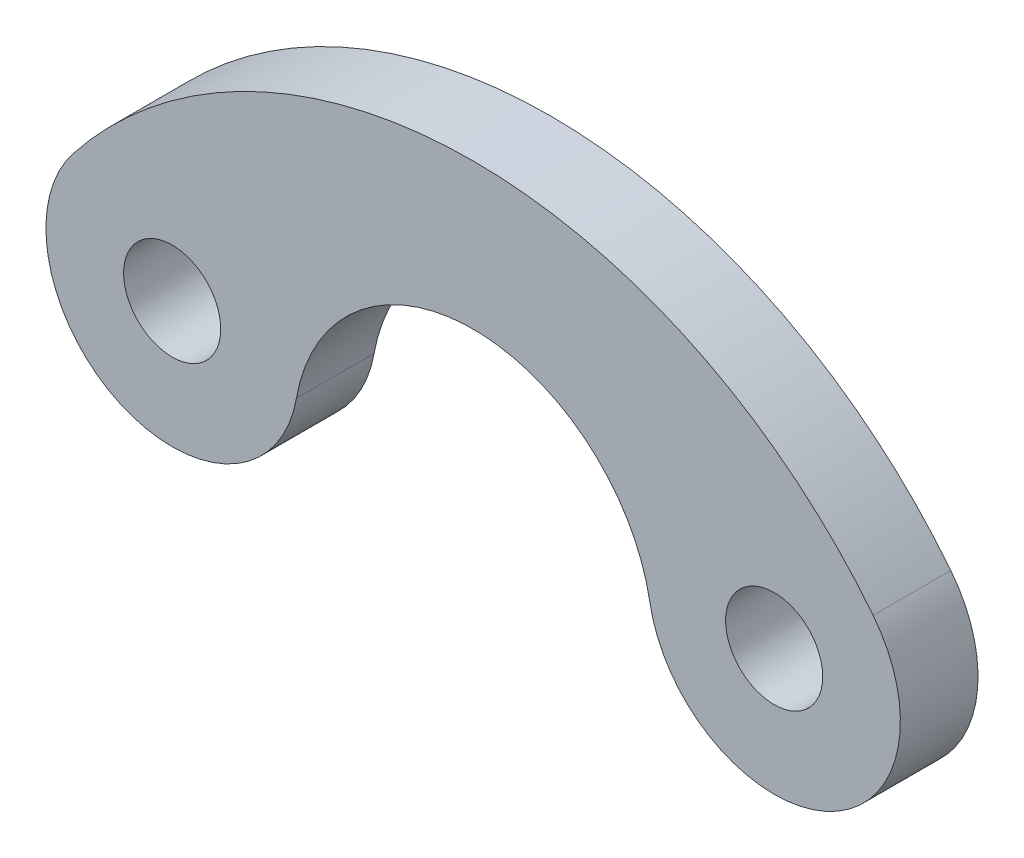
ISO-10303-21;
HEADER;
FILE_DESCRIPTION(('STEP AP214'),'2;1');
FILE_NAME('part.step','',(''),(''),'','','');
FILE_SCHEMA(('AUTOMOTIVE_DESIGN { 1 0 10303 214 1 1 1 1 }'));
ENDSEC;
DATA;
#1=APPLICATION_CONTEXT('core data for automotive mechanical design processes');
#2=APPLICATION_PROTOCOL_DEFINITION('international standard','automotive_design',2000,#1);
#3=PRODUCT_CONTEXT('',#1,'mechanical');
#4=PRODUCT('Part','Part','',(#3));
#5=PRODUCT_RELATED_PRODUCT_CATEGORY('part','',(#4));
#6=PRODUCT_DEFINITION_FORMATION('','',#4);
#7=PRODUCT_DEFINITION_CONTEXT('part definition',#1,'design');
#8=PRODUCT_DEFINITION('design','',#6,#7);
#9=PRODUCT_DEFINITION_SHAPE('','',#8);
#10=(LENGTH_UNIT() NAMED_UNIT(*) SI_UNIT(.MILLI.,.METRE.));
#11=(NAMED_UNIT(*) PLANE_ANGLE_UNIT() SI_UNIT($,.RADIAN.));
#12=(NAMED_UNIT(*) SI_UNIT($,.STERADIAN.) SOLID_ANGLE_UNIT());
#13=UNCERTAINTY_MEASURE_WITH_UNIT(LENGTH_MEASURE(1.E-05),#10,'distance_accuracy_value','');
#14=(GEOMETRIC_REPRESENTATION_CONTEXT(3) GLOBAL_UNCERTAINTY_ASSIGNED_CONTEXT((#13)) GLOBAL_UNIT_ASSIGNED_CONTEXT((#10,
#11,#12)) REPRESENTATION_CONTEXT('',''));
#15=CARTESIAN_POINT('',(0.,0.,0.));
#16=DIRECTION('',(0.,0.,1.));
#17=DIRECTION('',(1.,0.,0.));
#18=AXIS2_PLACEMENT_3D('',#15,#16,#17);
#19=CARTESIAN_POINT('',(-3.937,-0.696057692307692,2.032));
#20=DIRECTION('',(0.,0.,-1.));
#21=DIRECTION('',(-1.,0.,0.));
#22=AXIS2_PLACEMENT_3D('',#19,#20,#21);
#23=PLANE('',#22);
#24=CARTESIAN_POINT('',(0.,0.,2.032));
#25=DIRECTION('',(0.,0.,1.));
#26=DIRECTION('',(1.,0.,0.));
#27=AXIS2_PLACEMENT_3D('',#24,#25,#26);
#28=CIRCLE('',#27,1.27);
#29=CARTESIAN_POINT('',(1.27,0.,2.032));
#30=VERTEX_POINT('',#29);
#31=EDGE_CURVE('E115',#30,#30,#28,.T.);
#32=ORIENTED_EDGE('',*,*,#31,.F.);
#33=EDGE_LOOP('',(#32));
#34=FACE_BOUND('',#33,.T.);
#35=CARTESIAN_POINT('',(-7.874,-1.39211538461538,2.032));
#36=DIRECTION('',(0.,0.,-1.));
#37=DIRECTION('',(-1.,0.,0.));
#38=AXIS2_PLACEMENT_3D('',#35,#36,#37);
#39=CIRCLE('',#38,4.69411538461539);
#40=CARTESIAN_POINT('',(-12.4964276114844,-0.574874770922418,2.032));
#41=VERTEX_POINT('',#40);
#42=CARTESIAN_POINT('',(-3.25157238851557,-0.574874770922417,2.032));
#43=VERTEX_POINT('',#42);
#44=EDGE_CURVE('E95',#41,#43,#39,.T.);
#45=ORIENTED_EDGE('',*,*,#44,.T.);
#46=CARTESIAN_POINT('',(0.,0.,2.032));
#47=DIRECTION('',(0.,0.,1.));
#48=DIRECTION('',(1.,0.,0.));
#49=AXIS2_PLACEMENT_3D('',#46,#47,#48);
#50=CIRCLE('',#49,3.30199999999999);
#51=CARTESIAN_POINT('',(2.58925801011804,2.04913322091061,2.032));
#52=VERTEX_POINT('',#51);
#53=EDGE_CURVE('E90',#43,#52,#50,.T.);
#54=ORIENTED_EDGE('',*,*,#53,.T.);
#55=CARTESIAN_POINT('',(-7.874,-6.23146666666666,2.032));
#56=DIRECTION('',(0.,0.,1.));
#57=DIRECTION('',(-1.,0.,0.));
#58=AXIS2_PLACEMENT_3D('',#55,#56,#57);
#59=CIRCLE('',#58,13.3434666666666);
#60=CARTESIAN_POINT('',(-18.337258010118,2.04913322091062,2.032));
#61=VERTEX_POINT('',#60);
#62=EDGE_CURVE('E93',#52,#61,#59,.T.);
#63=ORIENTED_EDGE('',*,*,#62,.T.);
#64=CARTESIAN_POINT('',(-15.748,0.,2.032));
#65=DIRECTION('',(0.,0.,1.));
#66=DIRECTION('',(1.,0.,0.));
#67=AXIS2_PLACEMENT_3D('',#64,#65,#66);
#68=CIRCLE('',#67,3.30199999999999);
#69=EDGE_CURVE('E60',#61,#41,#68,.T.);
#70=ORIENTED_EDGE('',*,*,#69,.T.);
#71=EDGE_LOOP('',(#45,#54,#63,#70));
#72=FACE_BOUND('',#71,.T.);
#73=CARTESIAN_POINT('',(-15.748,0.,2.032));
#74=DIRECTION('',(0.,0.,1.));
#75=DIRECTION('',(1.,0.,0.));
#76=AXIS2_PLACEMENT_3D('',#73,#74,#75);
#77=CIRCLE('',#76,1.27);
#78=CARTESIAN_POINT('',(-14.478,0.,2.032));
#79=VERTEX_POINT('',#78);
#80=EDGE_CURVE('E132',#79,#79,#77,.T.);
#81=ORIENTED_EDGE('',*,*,#80,.F.);
#82=EDGE_LOOP('',(#81));
#83=FACE_BOUND('',#82,.T.);
#84=ADVANCED_FACE('F41',(#34,#72,#83),#23,.F.);
#85=CARTESIAN_POINT('',(-3.937,-0.696057692307692,0.));
#86=DIRECTION('',(0.,0.,-1.));
#87=DIRECTION('',(-1.,0.,0.));
#88=AXIS2_PLACEMENT_3D('',#85,#86,#87);
#89=PLANE('',#88);
#90=CARTESIAN_POINT('',(0.,0.,0.));
#91=DIRECTION('',(0.,0.,1.));
#92=DIRECTION('',(1.,0.,0.));
#93=AXIS2_PLACEMENT_3D('',#90,#91,#92);
#94=CIRCLE('',#93,1.27);
#95=CARTESIAN_POINT('',(1.27,0.,0.));
#96=VERTEX_POINT('',#95);
#97=EDGE_CURVE('E129',#96,#96,#94,.T.);
#98=ORIENTED_EDGE('',*,*,#97,.T.);
#99=EDGE_LOOP('',(#98));
#100=FACE_BOUND('',#99,.T.);
#101=CARTESIAN_POINT('',(-7.874,-1.39211538461538,0.));
#102=DIRECTION('',(0.,0.,-1.));
#103=DIRECTION('',(-1.,0.,0.));
#104=AXIS2_PLACEMENT_3D('',#101,#102,#103);
#105=CIRCLE('',#104,4.69411538461539);
#106=CARTESIAN_POINT('',(-12.4964276114844,-0.574874770922418,0.));
#107=VERTEX_POINT('',#106);
#108=CARTESIAN_POINT('',(-3.25157238851557,-0.574874770922417,0.));
#109=VERTEX_POINT('',#108);
#110=EDGE_CURVE('E111',#107,#109,#105,.T.);
#111=ORIENTED_EDGE('',*,*,#110,.F.);
#112=CARTESIAN_POINT('',(-15.748,0.,0.));
#113=DIRECTION('',(0.,0.,1.));
#114=DIRECTION('',(1.,0.,0.));
#115=AXIS2_PLACEMENT_3D('',#112,#113,#114);
#116=CIRCLE('',#115,3.30199999999999);
#117=CARTESIAN_POINT('',(-18.337258010118,2.04913322091062,0.));
#118=VERTEX_POINT('',#117);
#119=EDGE_CURVE('E83',#118,#107,#116,.T.);
#120=ORIENTED_EDGE('',*,*,#119,.F.);
#121=CARTESIAN_POINT('',(-7.874,-6.23146666666666,0.));
#122=DIRECTION('',(0.,0.,1.));
#123=DIRECTION('',(-1.,0.,0.));
#124=AXIS2_PLACEMENT_3D('',#121,#122,#123);
#125=CIRCLE('',#124,13.3434666666666);
#126=CARTESIAN_POINT('',(2.58925801011804,2.04913322091061,0.));
#127=VERTEX_POINT('',#126);
#128=EDGE_CURVE('E77',#127,#118,#125,.T.);
#129=ORIENTED_EDGE('',*,*,#128,.F.);
#130=CARTESIAN_POINT('',(0.,0.,0.));
#131=DIRECTION('',(0.,0.,1.));
#132=DIRECTION('',(1.,0.,0.));
#133=AXIS2_PLACEMENT_3D('',#130,#131,#132);
#134=CIRCLE('',#133,3.30199999999999);
#135=EDGE_CURVE('E99',#109,#127,#134,.T.);
#136=ORIENTED_EDGE('',*,*,#135,.F.);
#137=EDGE_LOOP('',(#111,#120,#129,#136));
#138=FACE_BOUND('',#137,.T.);
#139=CARTESIAN_POINT('',(-15.748,0.,0.));
#140=DIRECTION('',(0.,0.,1.));
#141=DIRECTION('',(1.,0.,0.));
#142=AXIS2_PLACEMENT_3D('',#139,#140,#141);
#143=CIRCLE('',#142,1.27);
#144=CARTESIAN_POINT('',(-14.478,0.,0.));
#145=VERTEX_POINT('',#144);
#146=EDGE_CURVE('E135',#145,#145,#143,.T.);
#147=ORIENTED_EDGE('',*,*,#146,.T.);
#148=EDGE_LOOP('',(#147));
#149=FACE_BOUND('',#148,.T.);
#150=ADVANCED_FACE('F124',(#100,#138,#149),#89,.T.);
#151=CARTESIAN_POINT('',(-7.874,-1.39211538461538,2.032));
#152=DIRECTION('',(0.,0.,-1.));
#153=DIRECTION('',(-1.,0.,0.));
#154=AXIS2_PLACEMENT_3D('',#151,#152,#153);
#155=CYLINDRICAL_SURFACE('',#154,4.69411538461539);
#156=ORIENTED_EDGE('',*,*,#110,.T.);
#157=DIRECTION('',(0.,0.,-1.));
#158=VECTOR('',#157,1.);
#159=CARTESIAN_POINT('',(-3.25157238851557,-0.574874770922417,2.032));
#160=LINE('',#159,#158);
#161=EDGE_CURVE('E11',#43,#109,#160,.T.);
#162=ORIENTED_EDGE('',*,*,#161,.F.);
#163=ORIENTED_EDGE('',*,*,#44,.F.);
#164=DIRECTION('',(0.,0.,-1.));
#165=VECTOR('',#164,1.);
#166=CARTESIAN_POINT('',(-12.4964276114844,-0.574874770922418,2.032));
#167=LINE('',#166,#165);
#168=EDGE_CURVE('E107',#41,#107,#167,.T.);
#169=ORIENTED_EDGE('',*,*,#168,.T.);
#170=EDGE_LOOP('',(#156,#162,#163,#169));
#171=FACE_BOUND('',#170,.T.);
#172=ADVANCED_FACE('F43',(#171),#155,.F.);
#173=CARTESIAN_POINT('',(0.,0.,2.032));
#174=DIRECTION('',(0.,0.,-1.));
#175=DIRECTION('',(-1.,0.,0.));
#176=AXIS2_PLACEMENT_3D('',#173,#174,#175);
#177=CYLINDRICAL_SURFACE('',#176,3.30199999999999);
#178=ORIENTED_EDGE('',*,*,#135,.T.);
#179=DIRECTION('',(0.,0.,-1.));
#180=VECTOR('',#179,1.);
#181=CARTESIAN_POINT('',(2.58925801011804,2.04913322091061,2.032));
#182=LINE('',#181,#180);
#183=EDGE_CURVE('E50',#52,#127,#182,.T.);
#184=ORIENTED_EDGE('',*,*,#183,.F.);
#185=ORIENTED_EDGE('',*,*,#53,.F.);
#186=ORIENTED_EDGE('',*,*,#161,.T.);
#187=EDGE_LOOP('',(#178,#184,#185,#186));
#188=FACE_BOUND('',#187,.T.);
#189=ADVANCED_FACE('F98',(#188),#177,.T.);
#190=CARTESIAN_POINT('',(-7.874,-6.23146666666666,2.032));
#191=DIRECTION('',(0.,0.,-1.));
#192=DIRECTION('',(-1.,0.,0.));
#193=AXIS2_PLACEMENT_3D('',#190,#191,#192);
#194=CYLINDRICAL_SURFACE('',#193,13.3434666666666);
#195=ORIENTED_EDGE('',*,*,#128,.T.);
#196=DIRECTION('',(0.,0.,-1.));
#197=VECTOR('',#196,1.);
#198=CARTESIAN_POINT('',(-18.337258010118,2.04913322091062,2.032));
#199=LINE('',#198,#197);
#200=EDGE_CURVE('E100',#61,#118,#199,.T.);
#201=ORIENTED_EDGE('',*,*,#200,.F.);
#202=ORIENTED_EDGE('',*,*,#62,.F.);
#203=ORIENTED_EDGE('',*,*,#183,.T.);
#204=EDGE_LOOP('',(#195,#201,#202,#203));
#205=FACE_BOUND('',#204,.T.);
#206=ADVANCED_FACE('F101',(#205),#194,.T.);
#207=CARTESIAN_POINT('',(-15.748,0.,2.032));
#208=DIRECTION('',(0.,0.,-1.));
#209=DIRECTION('',(-1.,0.,0.));
#210=AXIS2_PLACEMENT_3D('',#207,#208,#209);
#211=CYLINDRICAL_SURFACE('',#210,3.30199999999999);
#212=ORIENTED_EDGE('',*,*,#119,.T.);
#213=ORIENTED_EDGE('',*,*,#168,.F.);
#214=ORIENTED_EDGE('',*,*,#69,.F.);
#215=ORIENTED_EDGE('',*,*,#200,.T.);
#216=EDGE_LOOP('',(#212,#213,#214,#215));
#217=FACE_BOUND('',#216,.T.);
#218=ADVANCED_FACE('F121',(#217),#211,.T.);
#219=CARTESIAN_POINT('',(0.,0.,2.032));
#220=DIRECTION('',(0.,0.,-1.));
#221=DIRECTION('',(-1.,0.,0.));
#222=AXIS2_PLACEMENT_3D('',#219,#220,#221);
#223=CYLINDRICAL_SURFACE('',#222,1.27);
#224=ORIENTED_EDGE('',*,*,#31,.T.);
#225=EDGE_LOOP('',(#224));
#226=FACE_BOUND('',#225,.T.);
#227=ORIENTED_EDGE('',*,*,#97,.F.);
#228=EDGE_LOOP('',(#227));
#229=FACE_BOUND('',#228,.T.);
#230=ADVANCED_FACE('F155',(#226,#229),#223,.F.);
#231=CARTESIAN_POINT('',(-15.748,0.,2.032));
#232=DIRECTION('',(0.,0.,-1.));
#233=DIRECTION('',(-1.,0.,0.));
#234=AXIS2_PLACEMENT_3D('',#231,#232,#233);
#235=CYLINDRICAL_SURFACE('',#234,1.27);
#236=ORIENTED_EDGE('',*,*,#80,.T.);
#237=EDGE_LOOP('',(#236));
#238=FACE_BOUND('',#237,.T.);
#239=ORIENTED_EDGE('',*,*,#146,.F.);
#240=EDGE_LOOP('',(#239));
#241=FACE_BOUND('',#240,.T.);
#242=ADVANCED_FACE('F143',(#238,#241),#235,.F.);
#243=CLOSED_SHELL('',(#84,#150,#172,#189,#206,#218,#230,#242));
#244=MANIFOLD_SOLID_BREP('B2',#243);
#245=ADVANCED_BREP_SHAPE_REPRESENTATION('',(#18,#244),#14);
#246=SHAPE_DEFINITION_REPRESENTATION(#9,#245);
ENDSEC;
END-ISO-10303-21;
